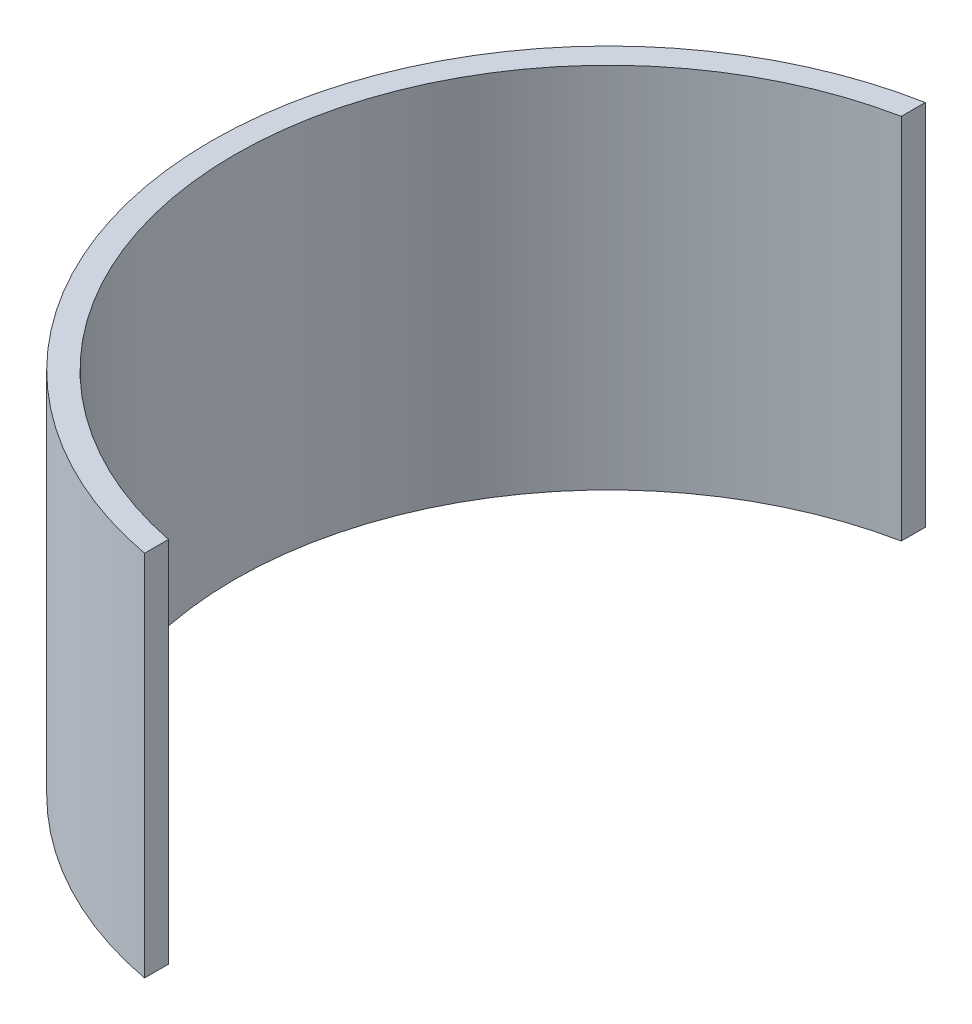
ISO-10303-21;
HEADER;
FILE_DESCRIPTION(('STEP AP214'),'2;1');
FILE_NAME('part.step','',(''),(''),'','','');
FILE_SCHEMA(('AUTOMOTIVE_DESIGN { 1 0 10303 214 1 1 1 1 }'));
ENDSEC;
DATA;
#1=APPLICATION_CONTEXT('core data for automotive mechanical design processes');
#2=APPLICATION_PROTOCOL_DEFINITION('international standard','automotive_design',2000,#1);
#3=PRODUCT_CONTEXT('',#1,'mechanical');
#4=PRODUCT('Part','Part','',(#3));
#5=PRODUCT_RELATED_PRODUCT_CATEGORY('part','',(#4));
#6=PRODUCT_DEFINITION_FORMATION('','',#4);
#7=PRODUCT_DEFINITION_CONTEXT('part definition',#1,'design');
#8=PRODUCT_DEFINITION('design','',#6,#7);
#9=PRODUCT_DEFINITION_SHAPE('','',#8);
#10=(LENGTH_UNIT() NAMED_UNIT(*) SI_UNIT(.MILLI.,.METRE.));
#11=(NAMED_UNIT(*) PLANE_ANGLE_UNIT() SI_UNIT($,.RADIAN.));
#12=(NAMED_UNIT(*) SI_UNIT($,.STERADIAN.) SOLID_ANGLE_UNIT());
#13=UNCERTAINTY_MEASURE_WITH_UNIT(LENGTH_MEASURE(1.E-05),#10,'distance_accuracy_value','');
#14=(GEOMETRIC_REPRESENTATION_CONTEXT(3) GLOBAL_UNCERTAINTY_ASSIGNED_CONTEXT((#13)) GLOBAL_UNIT_ASSIGNED_CONTEXT((#10,
#11,#12)) REPRESENTATION_CONTEXT('',''));
#15=CARTESIAN_POINT('',(0.,0.,0.));
#16=DIRECTION('',(0.,0.,1.));
#17=DIRECTION('',(1.,0.,0.));
#18=AXIS2_PLACEMENT_3D('',#15,#16,#17);
#19=CARTESIAN_POINT('',(0.,50.,0.));
#20=DIRECTION('',(0.,-1.,0.));
#21=DIRECTION('',(0.,0.,-1.));
#22=AXIS2_PLACEMENT_3D('',#19,#20,#21);
#23=CYLINDRICAL_SURFACE('',#22,50.8);
#24=CARTESIAN_POINT('',(0.,0.,0.));
#25=DIRECTION('',(0.,-1.,0.));
#26=DIRECTION('',(0.,0.,1.));
#27=AXIS2_PLACEMENT_3D('',#24,#25,#26);
#28=CIRCLE('',#27,50.8);
#29=CARTESIAN_POINT('',(-10.,0.,49.8060237320748));
#30=VERTEX_POINT('',#29);
#31=CARTESIAN_POINT('',(-10.,0.,-49.8060237320748));
#32=VERTEX_POINT('',#31);
#33=EDGE_CURVE('E96',#30,#32,#28,.T.);
#34=ORIENTED_EDGE('',*,*,#33,.T.);
#35=DIRECTION('',(0.,-1.,0.));
#36=VECTOR('',#35,1.);
#37=CARTESIAN_POINT('',(-10.,50.,-49.8060237320748));
#38=LINE('',#37,#36);
#39=CARTESIAN_POINT('',(-10.,50.,-49.8060237320748));
#40=VERTEX_POINT('',#39);
#41=EDGE_CURVE('E55',#32,#40,#38,.F.);
#42=ORIENTED_EDGE('',*,*,#41,.T.);
#43=CARTESIAN_POINT('',(0.,50.,0.));
#44=DIRECTION('',(0.,-1.,0.));
#45=DIRECTION('',(0.,0.,1.));
#46=AXIS2_PLACEMENT_3D('',#43,#44,#45);
#47=CIRCLE('',#46,50.8);
#48=CARTESIAN_POINT('',(-10.,50.,49.8060237320748));
#49=VERTEX_POINT('',#48);
#50=EDGE_CURVE('E87',#49,#40,#47,.T.);
#51=ORIENTED_EDGE('',*,*,#50,.F.);
#52=DIRECTION('',(0.,-1.,0.));
#53=VECTOR('',#52,1.);
#54=CARTESIAN_POINT('',(-10.,50.,49.8060237320748));
#55=LINE('',#54,#53);
#56=EDGE_CURVE('E78',#49,#30,#55,.T.);
#57=ORIENTED_EDGE('',*,*,#56,.T.);
#58=EDGE_LOOP('',(#34,#42,#51,#57));
#59=FACE_BOUND('',#58,.T.);
#60=ADVANCED_FACE('F33',(#59),#23,.F.);
#61=CARTESIAN_POINT('',(0.,50.,0.));
#62=DIRECTION('',(0.,-1.,0.));
#63=DIRECTION('',(0.,0.,-1.));
#64=AXIS2_PLACEMENT_3D('',#61,#62,#63);
#65=CYLINDRICAL_SURFACE('',#64,54.);
#66=CARTESIAN_POINT('',(0.,50.,0.));
#67=DIRECTION('',(0.,1.,0.));
#68=DIRECTION('',(0.,0.,1.));
#69=AXIS2_PLACEMENT_3D('',#66,#67,#68);
#70=CIRCLE('',#69,54.);
#71=CARTESIAN_POINT('',(-10.,50.,-53.0659966456864));
#72=VERTEX_POINT('',#71);
#73=CARTESIAN_POINT('',(-10.,50.,53.0659966456864));
#74=VERTEX_POINT('',#73);
#75=EDGE_CURVE('E85',#72,#74,#70,.T.);
#76=ORIENTED_EDGE('',*,*,#75,.F.);
#77=DIRECTION('',(0.,-1.,0.));
#78=VECTOR('',#77,1.);
#79=CARTESIAN_POINT('',(-10.,50.,-53.0659966456864));
#80=LINE('',#79,#78);
#81=CARTESIAN_POINT('',(-10.,0.,-53.0659966456864));
#82=VERTEX_POINT('',#81);
#83=EDGE_CURVE('E70',#72,#82,#80,.T.);
#84=ORIENTED_EDGE('',*,*,#83,.T.);
#85=CARTESIAN_POINT('',(0.,0.,0.));
#86=DIRECTION('',(0.,1.,0.));
#87=DIRECTION('',(0.,0.,1.));
#88=AXIS2_PLACEMENT_3D('',#85,#86,#87);
#89=CIRCLE('',#88,54.);
#90=CARTESIAN_POINT('',(-10.,0.,53.0659966456864));
#91=VERTEX_POINT('',#90);
#92=EDGE_CURVE('E92',#82,#91,#89,.T.);
#93=ORIENTED_EDGE('',*,*,#92,.T.);
#94=DIRECTION('',(0.,-1.,0.));
#95=VECTOR('',#94,1.);
#96=CARTESIAN_POINT('',(-10.,50.,53.0659966456864));
#97=LINE('',#96,#95);
#98=EDGE_CURVE('E47',#91,#74,#97,.F.);
#99=ORIENTED_EDGE('',*,*,#98,.T.);
#100=EDGE_LOOP('',(#76,#84,#93,#99));
#101=FACE_BOUND('',#100,.T.);
#102=ADVANCED_FACE('F90',(#101),#65,.T.);
#103=CARTESIAN_POINT('',(0.,50.,0.));
#104=DIRECTION('',(0.,1.,0.));
#105=DIRECTION('',(0.,0.,1.));
#106=AXIS2_PLACEMENT_3D('',#103,#104,#105);
#107=PLANE('',#106);
#108=DIRECTION('',(0.,0.,1.));
#109=VECTOR('',#108,1.);
#110=CARTESIAN_POINT('',(-10.,50.,54.));
#111=LINE('',#110,#109);
#112=EDGE_CURVE('E73',#72,#40,#111,.T.);
#113=ORIENTED_EDGE('',*,*,#112,.F.);
#114=ORIENTED_EDGE('',*,*,#75,.T.);
#115=EDGE_CURVE('E88',#49,#74,#111,.T.);
#116=ORIENTED_EDGE('',*,*,#115,.F.);
#117=ORIENTED_EDGE('',*,*,#50,.T.);
#118=EDGE_LOOP('',(#113,#114,#116,#117));
#119=FACE_BOUND('',#118,.T.);
#120=ADVANCED_FACE('F83',(#119),#107,.T.);
#121=CARTESIAN_POINT('',(0.,0.,0.));
#122=DIRECTION('',(0.,1.,0.));
#123=DIRECTION('',(0.,0.,1.));
#124=AXIS2_PLACEMENT_3D('',#121,#122,#123);
#125=PLANE('',#124);
#126=ORIENTED_EDGE('',*,*,#92,.F.);
#127=DIRECTION('',(0.,0.,1.));
#128=VECTOR('',#127,1.);
#129=CARTESIAN_POINT('',(-10.,0.,0.));
#130=LINE('',#129,#128);
#131=EDGE_CURVE('E11',#82,#32,#130,.T.);
#132=ORIENTED_EDGE('',*,*,#131,.T.);
#133=ORIENTED_EDGE('',*,*,#33,.F.);
#134=EDGE_CURVE('E36',#30,#91,#130,.T.);
#135=ORIENTED_EDGE('',*,*,#134,.T.);
#136=EDGE_LOOP('',(#126,#132,#133,#135));
#137=FACE_BOUND('',#136,.T.);
#138=ADVANCED_FACE('F99',(#137),#125,.F.);
#139=CARTESIAN_POINT('',(-10.,0.,54.));
#140=DIRECTION('',(-1.,0.,0.));
#141=DIRECTION('',(0.,0.,1.));
#142=AXIS2_PLACEMENT_3D('',#139,#140,#141);
#143=PLANE('',#142);
#144=ORIENTED_EDGE('',*,*,#115,.T.);
#145=ORIENTED_EDGE('',*,*,#98,.F.);
#146=ORIENTED_EDGE('',*,*,#134,.F.);
#147=ORIENTED_EDGE('',*,*,#56,.F.);
#148=EDGE_LOOP('',(#144,#145,#146,#147));
#149=FACE_BOUND('',#148,.T.);
#150=ADVANCED_FACE('F102',(#149),#143,.F.);
#151=ORIENTED_EDGE('',*,*,#131,.F.);
#152=ORIENTED_EDGE('',*,*,#83,.F.);
#153=ORIENTED_EDGE('',*,*,#112,.T.);
#154=ORIENTED_EDGE('',*,*,#41,.F.);
#155=EDGE_LOOP('',(#151,#152,#153,#154));
#156=FACE_BOUND('',#155,.T.);
#157=ADVANCED_FACE('F72',(#156),#143,.F.);
#158=CLOSED_SHELL('',(#60,#102,#120,#138,#150,#157));
#159=MANIFOLD_SOLID_BREP('B2',#158);
#160=ADVANCED_BREP_SHAPE_REPRESENTATION('',(#18,#159),#14);
#161=SHAPE_DEFINITION_REPRESENTATION(#9,#160);
ENDSEC;
END-ISO-10303-21;
